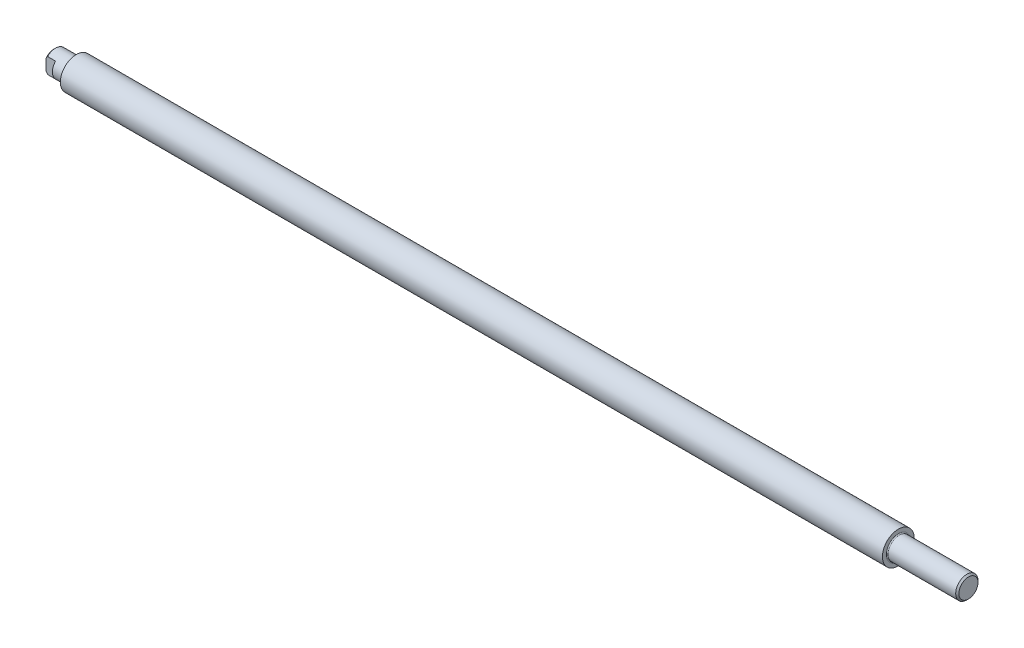
ISO-10303-21;
HEADER;
FILE_DESCRIPTION(('STEP AP214'),'2;1');
FILE_NAME('part.step','',(''),(''),'','','');
FILE_SCHEMA(('AUTOMOTIVE_DESIGN { 1 0 10303 214 1 1 1 1 }'));
ENDSEC;
DATA;
#1=APPLICATION_CONTEXT('core data for automotive mechanical design processes');
#2=APPLICATION_PROTOCOL_DEFINITION('international standard','automotive_design',2000,#1);
#3=PRODUCT_CONTEXT('',#1,'mechanical');
#4=PRODUCT('Part','Part','',(#3));
#5=PRODUCT_RELATED_PRODUCT_CATEGORY('part','',(#4));
#6=PRODUCT_DEFINITION_FORMATION('','',#4);
#7=PRODUCT_DEFINITION_CONTEXT('part definition',#1,'design');
#8=PRODUCT_DEFINITION('design','',#6,#7);
#9=PRODUCT_DEFINITION_SHAPE('','',#8);
#10=(LENGTH_UNIT() NAMED_UNIT(*) SI_UNIT(.MILLI.,.METRE.));
#11=(NAMED_UNIT(*) PLANE_ANGLE_UNIT() SI_UNIT($,.RADIAN.));
#12=(NAMED_UNIT(*) SI_UNIT($,.STERADIAN.) SOLID_ANGLE_UNIT());
#13=UNCERTAINTY_MEASURE_WITH_UNIT(LENGTH_MEASURE(1.E-05),#10,'distance_accuracy_value','');
#14=(GEOMETRIC_REPRESENTATION_CONTEXT(3) GLOBAL_UNCERTAINTY_ASSIGNED_CONTEXT((#13)) GLOBAL_UNIT_ASSIGNED_CONTEXT((#10,
#11,#12)) REPRESENTATION_CONTEXT('',''));
#15=CARTESIAN_POINT('',(0.,0.,0.));
#16=DIRECTION('',(0.,0.,1.));
#17=DIRECTION('',(1.,0.,0.));
#18=AXIS2_PLACEMENT_3D('',#15,#16,#17);
#19=CARTESIAN_POINT('',(265.,0.,0.));
#20=DIRECTION('',(1.,0.,0.));
#21=DIRECTION('',(0.,0.,-1.));
#22=AXIS2_PLACEMENT_3D('',#19,#20,#21);
#23=PLANE('',#22);
#24=CARTESIAN_POINT('',(265.,0.,0.));
#25=DIRECTION('',(1.,0.,0.));
#26=DIRECTION('',(0.,0.,-1.));
#27=AXIS2_PLACEMENT_3D('',#24,#25,#26);
#28=CIRCLE('',#27,3.79999999999988);
#29=CARTESIAN_POINT('',(265.,0.,-3.79999999999988));
#30=VERTEX_POINT('',#29);
#31=EDGE_CURVE('E11',#30,#30,#28,.F.);
#32=ORIENTED_EDGE('',*,*,#31,.T.);
#33=EDGE_LOOP('',(#32));
#34=FACE_BOUND('',#33,.T.);
#35=CARTESIAN_POINT('',(265.,0.,0.));
#36=DIRECTION('',(1.,0.,0.));
#37=DIRECTION('',(0.,0.,-1.));
#38=AXIS2_PLACEMENT_3D('',#35,#36,#37);
#39=CIRCLE('',#38,5.);
#40=CARTESIAN_POINT('',(265.,0.,-5.));
#41=VERTEX_POINT('',#40);
#42=EDGE_CURVE('E82',#41,#41,#39,.T.);
#43=ORIENTED_EDGE('',*,*,#42,.T.);
#44=EDGE_LOOP('',(#43));
#45=FACE_BOUND('',#44,.T.);
#46=ADVANCED_FACE('F33',(#34,#45),#23,.T.);
#47=CARTESIAN_POINT('',(7.,5.,0.));
#48=DIRECTION('',(-1.,0.,0.));
#49=DIRECTION('',(0.,0.,1.));
#50=AXIS2_PLACEMENT_3D('',#47,#48,#49);
#51=PLANE('',#50);
#52=CARTESIAN_POINT('',(7.,0.,0.));
#53=DIRECTION('',(-1.,0.,0.));
#54=DIRECTION('',(0.,0.,1.));
#55=AXIS2_PLACEMENT_3D('',#52,#53,#54);
#56=CIRCLE('',#55,3.79999999999989);
#57=CARTESIAN_POINT('',(7.,0.,3.79999999999989));
#58=VERTEX_POINT('',#57);
#59=EDGE_CURVE('E162',#58,#58,#56,.F.);
#60=ORIENTED_EDGE('',*,*,#59,.T.);
#61=EDGE_LOOP('',(#60));
#62=FACE_BOUND('',#61,.T.);
#63=CARTESIAN_POINT('',(7.00000000000001,0.,0.));
#64=DIRECTION('',(1.,0.,0.));
#65=DIRECTION('',(0.,0.,-1.));
#66=AXIS2_PLACEMENT_3D('',#63,#64,#65);
#67=CIRCLE('',#66,5.);
#68=CARTESIAN_POINT('',(7.00000000000001,0.,-5.));
#69=VERTEX_POINT('',#68);
#70=EDGE_CURVE('E88',#69,#69,#67,.T.);
#71=ORIENTED_EDGE('',*,*,#70,.F.);
#72=EDGE_LOOP('',(#71));
#73=FACE_BOUND('',#72,.T.);
#74=ADVANCED_FACE('F130',(#62,#73),#51,.T.);
#75=CARTESIAN_POINT('',(7.,0.,0.));
#76=DIRECTION('',(1.,0.,0.));
#77=DIRECTION('',(0.,0.,-1.));
#78=AXIS2_PLACEMENT_3D('',#75,#76,#77);
#79=CYLINDRICAL_SURFACE('',#78,5.);
#80=ORIENTED_EDGE('',*,*,#70,.T.);
#81=EDGE_LOOP('',(#80));
#82=FACE_BOUND('',#81,.T.);
#83=ORIENTED_EDGE('',*,*,#42,.F.);
#84=EDGE_LOOP('',(#83));
#85=FACE_BOUND('',#84,.T.);
#86=ADVANCED_FACE('F126',(#82,#85),#79,.T.);
#87=CARTESIAN_POINT('',(0.,0.,0.));
#88=DIRECTION('',(1.,0.,0.));
#89=DIRECTION('',(0.,0.,-1.));
#90=AXIS2_PLACEMENT_3D('',#87,#88,#89);
#91=CYLINDRICAL_SURFACE('',#90,3.5);
#92=CARTESIAN_POINT('',(6.70000000000011,0.,0.));
#93=DIRECTION('',(-1.,0.,0.));
#94=DIRECTION('',(0.,0.,1.));
#95=AXIS2_PLACEMENT_3D('',#92,#93,#94);
#96=CIRCLE('',#95,3.5);
#97=CARTESIAN_POINT('',(6.70000000000011,0.,3.5));
#98=VERTEX_POINT('',#97);
#99=EDGE_CURVE('E164',#98,#98,#96,.T.);
#100=ORIENTED_EDGE('',*,*,#99,.T.);
#101=EDGE_LOOP('',(#100));
#102=FACE_BOUND('',#101,.T.);
#103=DIRECTION('',(-1.,0.,0.));
#104=VECTOR('',#103,1.);
#105=CARTESIAN_POINT('',(3.,-2.44948974278318,2.5));
#106=LINE('',#105,#104);
#107=CARTESIAN_POINT('',(3.,-2.44948974278318,2.5));
#108=VERTEX_POINT('',#107);
#109=CARTESIAN_POINT('',(0.500000000007018,-2.44948974278318,2.5));
#110=VERTEX_POINT('',#109);
#111=EDGE_CURVE('E78',#108,#110,#106,.T.);
#112=ORIENTED_EDGE('',*,*,#111,.T.);
#113=CARTESIAN_POINT('',(0.500000000007018,0.,0.));
#114=DIRECTION('',(-1.,0.,0.));
#115=DIRECTION('',(0.,0.,1.));
#116=AXIS2_PLACEMENT_3D('',#113,#114,#115);
#117=CIRCLE('',#116,3.5);
#118=CARTESIAN_POINT('',(0.500000000007018,2.44948974278318,2.5));
#119=VERTEX_POINT('',#118);
#120=EDGE_CURVE('E48',#110,#119,#117,.F.);
#121=ORIENTED_EDGE('',*,*,#120,.T.);
#122=DIRECTION('',(-1.,0.,0.));
#123=VECTOR('',#122,1.);
#124=CARTESIAN_POINT('',(3.,2.44948974278318,2.5));
#125=LINE('',#124,#123);
#126=CARTESIAN_POINT('',(3.,2.44948974278318,2.5));
#127=VERTEX_POINT('',#126);
#128=EDGE_CURVE('E76',#127,#119,#125,.T.);
#129=ORIENTED_EDGE('',*,*,#128,.F.);
#130=CARTESIAN_POINT('',(3.,0.,0.));
#131=DIRECTION('',(-1.,0.,0.));
#132=DIRECTION('',(0.,0.,1.));
#133=AXIS2_PLACEMENT_3D('',#130,#131,#132);
#134=CIRCLE('',#133,3.5);
#135=EDGE_CURVE('E69',#108,#127,#134,.T.);
#136=ORIENTED_EDGE('',*,*,#135,.F.);
#137=EDGE_LOOP('',(#112,#121,#129,#136));
#138=FACE_BOUND('',#137,.T.);
#139=ADVANCED_FACE('F80',(#102,#138),#91,.T.);
#140=CARTESIAN_POINT('',(0.,0.,0.));
#141=DIRECTION('',(-1.,0.,0.));
#142=DIRECTION('',(0.,0.,1.));
#143=AXIS2_PLACEMENT_3D('',#140,#141,#142);
#144=PLANE('',#143);
#145=DIRECTION('',(0.,-1.,0.));
#146=VECTOR('',#145,1.);
#147=CARTESIAN_POINT('',(0.,2.44948974278318,2.5));
#148=LINE('',#147,#146);
#149=CARTESIAN_POINT('',(0.,1.65831239516505,2.5));
#150=VERTEX_POINT('',#149);
#151=CARTESIAN_POINT('',(0.,-1.65831239516505,2.5));
#152=VERTEX_POINT('',#151);
#153=EDGE_CURVE('E73',#150,#152,#148,.T.);
#154=ORIENTED_EDGE('',*,*,#153,.F.);
#155=CARTESIAN_POINT('',(0.,0.,0.));
#156=DIRECTION('',(-1.,0.,0.));
#157=DIRECTION('',(0.,0.,1.));
#158=AXIS2_PLACEMENT_3D('',#155,#156,#157);
#159=CIRCLE('',#158,2.99999999999301);
#160=EDGE_CURVE('E97',#150,#152,#159,.T.);
#161=ORIENTED_EDGE('',*,*,#160,.T.);
#162=EDGE_LOOP('',(#154,#161));
#163=FACE_BOUND('',#162,.T.);
#164=ADVANCED_FACE('F118',(#163),#144,.T.);
#165=CARTESIAN_POINT('',(3.,2.44948974278318,2.5));
#166=DIRECTION('',(0.,0.,-1.));
#167=DIRECTION('',(-1.,0.,0.));
#168=AXIS2_PLACEMENT_3D('',#165,#166,#167);
#169=PLANE('',#168);
#170=ORIENTED_EDGE('',*,*,#153,.T.);
#171=CARTESIAN_POINT('',(0.,-1.65831239516505,2.5));
#172=CARTESIAN_POINT('',(0.0377809523451793,-1.7266330545231,2.5));
#173=CARTESIAN_POINT('',(0.0767732564831247,-1.79426868491071,2.5));
#174=CARTESIAN_POINT('',(0.1567874453838,-1.92826794918863,2.5));
#175=CARTESIAN_POINT('',(0.197807919053219,-1.99463242409499,2.5));
#176=CARTESIAN_POINT('',(0.281531404899737,-2.12627015613553,2.5));
#177=CARTESIAN_POINT('',(0.324234143713195,-2.19154358812609,2.5));
#178=CARTESIAN_POINT('',(0.411096215271819,-2.3211800929932,2.5));
#179=CARTESIAN_POINT('',(0.455256526277149,-2.38554251126645,2.5));
#180=CARTESIAN_POINT('',(0.500000000007018,-2.44948974278318,2.5));
#181=B_SPLINE_CURVE_WITH_KNOTS('',3,(#171,#172,#173,#174,#175,#176,#177,#178,#179,#180),
.UNSPECIFIED.,.F.,.F.,(4,2,2,2,4),(0.,0.234182191469756,0.468203683211642,0.702187302682748,
0.936331289720606),.UNSPECIFIED.);
#182=EDGE_CURVE('E56',#152,#110,#181,.T.);
#183=ORIENTED_EDGE('',*,*,#182,.T.);
#184=ORIENTED_EDGE('',*,*,#111,.F.);
#185=DIRECTION('',(0.,-1.,0.));
#186=VECTOR('',#185,1.);
#187=CARTESIAN_POINT('',(3.,2.44948974278318,2.5));
#188=LINE('',#187,#186);
#189=EDGE_CURVE('E72',#127,#108,#188,.T.);
#190=ORIENTED_EDGE('',*,*,#189,.F.);
#191=ORIENTED_EDGE('',*,*,#128,.T.);
#192=CARTESIAN_POINT('',(0.500000000007018,2.44948974278318,2.5));
#193=CARTESIAN_POINT('',(0.455256526277149,2.38554251126645,2.5));
#194=CARTESIAN_POINT('',(0.411096215271819,2.3211800929932,2.5));
#195=CARTESIAN_POINT('',(0.324234143713195,2.19154358812609,2.5));
#196=CARTESIAN_POINT('',(0.281531404899737,2.12627015613553,2.5));
#197=CARTESIAN_POINT('',(0.197807919053219,1.99463242409499,2.5));
#198=CARTESIAN_POINT('',(0.1567874453838,1.92826794918863,2.5));
#199=CARTESIAN_POINT('',(0.0767732564831244,1.79426868491071,2.5));
#200=CARTESIAN_POINT('',(0.0377809523451792,1.7266330545231,2.5));
#201=CARTESIAN_POINT('',(0.,1.65831239516505,2.5));
#202=B_SPLINE_CURVE_WITH_KNOTS('',3,(#192,#193,#194,#195,#196,#197,#198,#199,#200,#201),
.UNSPECIFIED.,.F.,.F.,(4,2,2,2,4),(0.,0.234143987037858,0.468127606508965,0.702149098250851,
0.936331289720607),.UNSPECIFIED.);
#203=EDGE_CURVE('E100',#119,#150,#202,.T.);
#204=ORIENTED_EDGE('',*,*,#203,.T.);
#205=EDGE_LOOP('',(#170,#183,#184,#190,#191,#204));
#206=FACE_BOUND('',#205,.T.);
#207=ADVANCED_FACE('F75',(#206),#169,.F.);
#208=CARTESIAN_POINT('',(3.,0.,0.));
#209=DIRECTION('',(-1.,0.,0.));
#210=DIRECTION('',(0.,0.,1.));
#211=AXIS2_PLACEMENT_3D('',#208,#209,#210);
#212=PLANE('',#211);
#213=ORIENTED_EDGE('',*,*,#135,.T.);
#214=ORIENTED_EDGE('',*,*,#189,.T.);
#215=EDGE_LOOP('',(#213,#214));
#216=FACE_BOUND('',#215,.T.);
#217=ADVANCED_FACE('F71',(#216),#212,.T.);
#218=CARTESIAN_POINT('',(287.,0.,0.));
#219=DIRECTION('',(-1.,0.,0.));
#220=DIRECTION('',(0.,0.,1.));
#221=AXIS2_PLACEMENT_3D('',#218,#219,#220);
#222=CYLINDRICAL_SURFACE('',#221,3.49999999999999);
#223=CARTESIAN_POINT('',(265.3,0.,0.));
#224=DIRECTION('',(1.,0.,0.));
#225=DIRECTION('',(0.,0.,-1.));
#226=AXIS2_PLACEMENT_3D('',#223,#224,#225);
#227=CIRCLE('',#226,3.49999999999999);
#228=CARTESIAN_POINT('',(265.3,0.,-3.49999999999999));
#229=VERTEX_POINT('',#228);
#230=EDGE_CURVE('E41',#229,#229,#227,.T.);
#231=ORIENTED_EDGE('',*,*,#230,.T.);
#232=EDGE_LOOP('',(#231));
#233=FACE_BOUND('',#232,.T.);
#234=CARTESIAN_POINT('',(286.499999999993,0.,0.));
#235=DIRECTION('',(1.,0.,0.));
#236=DIRECTION('',(0.,0.,-1.));
#237=AXIS2_PLACEMENT_3D('',#234,#235,#236);
#238=CIRCLE('',#237,3.49999999999999);
#239=CARTESIAN_POINT('',(286.499999999993,0.,-3.49999999999999));
#240=VERTEX_POINT('',#239);
#241=EDGE_CURVE('E94',#240,#240,#238,.F.);
#242=ORIENTED_EDGE('',*,*,#241,.T.);
#243=EDGE_LOOP('',(#242));
#244=FACE_BOUND('',#243,.T.);
#245=ADVANCED_FACE('F147',(#233,#244),#222,.T.);
#246=CARTESIAN_POINT('',(287.,0.,0.));
#247=DIRECTION('',(1.,0.,0.));
#248=DIRECTION('',(0.,0.,-1.));
#249=AXIS2_PLACEMENT_3D('',#246,#247,#248);
#250=PLANE('',#249);
#251=CARTESIAN_POINT('',(287.,0.,0.));
#252=DIRECTION('',(1.,0.,0.));
#253=DIRECTION('',(0.,0.,-1.));
#254=AXIS2_PLACEMENT_3D('',#251,#252,#253);
#255=CIRCLE('',#254,2.99999999999301);
#256=CARTESIAN_POINT('',(287.,0.,-2.99999999999301));
#257=VERTEX_POINT('',#256);
#258=EDGE_CURVE('E91',#257,#257,#255,.T.);
#259=ORIENTED_EDGE('',*,*,#258,.T.);
#260=EDGE_LOOP('',(#259));
#261=FACE_BOUND('',#260,.T.);
#262=ADVANCED_FACE('F139',(#261),#250,.T.);
#263=CARTESIAN_POINT('',(287.,0.,0.));
#264=DIRECTION('',(-1.,0.,0.));
#265=DIRECTION('',(0.,0.,1.));
#266=AXIS2_PLACEMENT_3D('',#263,#264,#265);
#267=CONICAL_SURFACE('',#266,2.99999999999301,0.785398163397435);
#268=ORIENTED_EDGE('',*,*,#241,.F.);
#269=EDGE_LOOP('',(#268));
#270=FACE_BOUND('',#269,.T.);
#271=ORIENTED_EDGE('',*,*,#258,.F.);
#272=EDGE_LOOP('',(#271));
#273=FACE_BOUND('',#272,.T.);
#274=ADVANCED_FACE('F137',(#270,#273),#267,.T.);
#275=CARTESIAN_POINT('',(0.,0.,0.));
#276=DIRECTION('',(1.,0.,0.));
#277=DIRECTION('',(0.,0.,-1.));
#278=AXIS2_PLACEMENT_3D('',#275,#276,#277);
#279=CONICAL_SURFACE('',#278,2.99999999999301,0.785398163397424);
#280=ORIENTED_EDGE('',*,*,#203,.F.);
#281=ORIENTED_EDGE('',*,*,#120,.F.);
#282=ORIENTED_EDGE('',*,*,#182,.F.);
#283=ORIENTED_EDGE('',*,*,#160,.F.);
#284=EDGE_LOOP('',(#280,#281,#282,#283));
#285=FACE_BOUND('',#284,.T.);
#286=ADVANCED_FACE('F111',(#285),#279,.T.);
#287=CARTESIAN_POINT('',(6.70000000000011,0.,0.));
#288=DIRECTION('',(-1.,0.,0.));
#289=DIRECTION('',(0.,0.,1.));
#290=AXIS2_PLACEMENT_3D('',#287,#288,#289);
#291=TOROIDAL_SURFACE('',#290,3.79999999999989,0.299999999999888);
#292=ORIENTED_EDGE('',*,*,#59,.F.);
#293=EDGE_LOOP('',(#292));
#294=FACE_BOUND('',#293,.T.);
#295=ORIENTED_EDGE('',*,*,#99,.F.);
#296=EDGE_LOOP('',(#295));
#297=FACE_BOUND('',#296,.T.);
#298=ADVANCED_FACE('F145',(#294,#297),#291,.F.);
#299=CARTESIAN_POINT('',(265.3,0.,0.));
#300=DIRECTION('',(1.,0.,0.));
#301=DIRECTION('',(0.,0.,-1.));
#302=AXIS2_PLACEMENT_3D('',#299,#300,#301);
#303=TOROIDAL_SURFACE('',#302,3.79999999999988,0.299999999999888);
#304=ORIENTED_EDGE('',*,*,#31,.F.);
#305=EDGE_LOOP('',(#304));
#306=FACE_BOUND('',#305,.T.);
#307=ORIENTED_EDGE('',*,*,#230,.F.);
#308=EDGE_LOOP('',(#307));
#309=FACE_BOUND('',#308,.T.);
#310=ADVANCED_FACE('F35',(#306,#309),#303,.F.);
#311=CLOSED_SHELL('',(#46,#74,#86,#139,#164,#207,#217,#245,#262,#274,#286,#298,#310));
#312=MANIFOLD_SOLID_BREP('B2',#311);
#313=ADVANCED_BREP_SHAPE_REPRESENTATION('',(#18,#312),#14);
#314=SHAPE_DEFINITION_REPRESENTATION(#9,#313);
ENDSEC;
END-ISO-10303-21;
